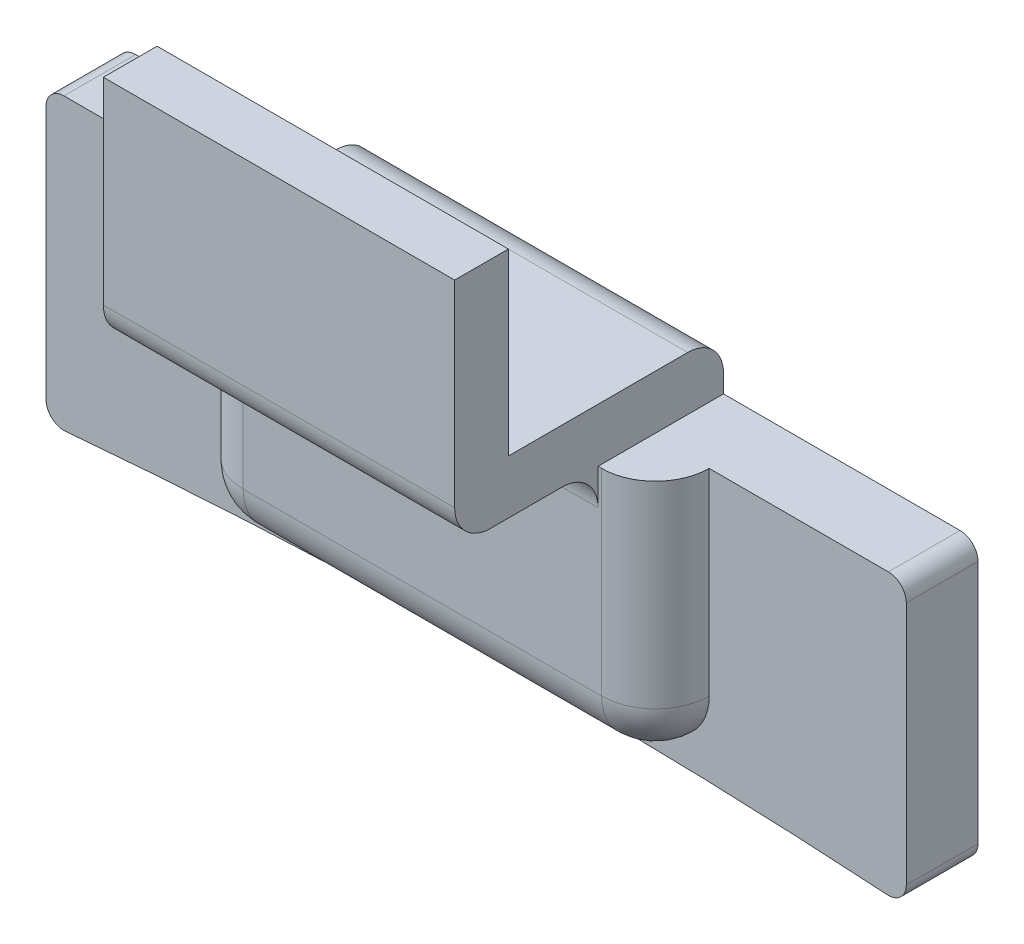
ISO-10303-21;
HEADER;
FILE_DESCRIPTION(('STEP AP214'),'2;1');
FILE_NAME('part.step','',(''),(''),'','','');
FILE_SCHEMA(('AUTOMOTIVE_DESIGN { 1 0 10303 214 1 1 1 1 }'));
ENDSEC;
DATA;
#1=APPLICATION_CONTEXT('core data for automotive mechanical design processes');
#2=APPLICATION_PROTOCOL_DEFINITION('international standard','automotive_design',2000,#1);
#3=PRODUCT_CONTEXT('',#1,'mechanical');
#4=PRODUCT('Part','Part','',(#3));
#5=PRODUCT_RELATED_PRODUCT_CATEGORY('part','',(#4));
#6=PRODUCT_DEFINITION_FORMATION('','',#4);
#7=PRODUCT_DEFINITION_CONTEXT('part definition',#1,'design');
#8=PRODUCT_DEFINITION('design','',#6,#7);
#9=PRODUCT_DEFINITION_SHAPE('','',#8);
#10=(LENGTH_UNIT() NAMED_UNIT(*) SI_UNIT(.MILLI.,.METRE.));
#11=(NAMED_UNIT(*) PLANE_ANGLE_UNIT() SI_UNIT($,.RADIAN.));
#12=(NAMED_UNIT(*) SI_UNIT($,.STERADIAN.) SOLID_ANGLE_UNIT());
#13=UNCERTAINTY_MEASURE_WITH_UNIT(LENGTH_MEASURE(1.E-05),#10,'distance_accuracy_value','');
#14=(GEOMETRIC_REPRESENTATION_CONTEXT(3) GLOBAL_UNCERTAINTY_ASSIGNED_CONTEXT((#13)) GLOBAL_UNIT_ASSIGNED_CONTEXT((#10,
#11,#12)) REPRESENTATION_CONTEXT('',''));
#15=CARTESIAN_POINT('',(0.,0.,0.));
#16=DIRECTION('',(0.,0.,1.));
#17=DIRECTION('',(1.,0.,0.));
#18=AXIS2_PLACEMENT_3D('',#15,#16,#17);
#19=CARTESIAN_POINT('',(0.,0.,7.));
#20=DIRECTION('',(0.,0.,-1.));
#21=DIRECTION('',(-1.,0.,0.));
#22=AXIS2_PLACEMENT_3D('',#19,#20,#21);
#23=PLANE('',#22);
#24=DIRECTION('',(-1.,0.,0.));
#25=VECTOR('',#24,1.);
#26=CARTESIAN_POINT('',(-16.5000000737673,0.,7.));
#27=LINE('',#26,#25);
#28=CARTESIAN_POINT('',(6.49999992623271,0.,7.));
#29=VERTEX_POINT('',#28);
#30=CARTESIAN_POINT('',(6.29999992623272,0.,7.));
#31=VERTEX_POINT('',#30);
#32=EDGE_CURVE('E252',#29,#31,#27,.T.);
#33=ORIENTED_EDGE('',*,*,#32,.T.);
#34=DIRECTION('',(0.,-1.,0.));
#35=VECTOR('',#34,1.);
#36=CARTESIAN_POINT('',(6.29999992623272,3.,7.));
#37=LINE('',#36,#35);
#38=CARTESIAN_POINT('',(6.29999992623272,-2.,7.));
#39=VERTEX_POINT('',#38);
#40=EDGE_CURVE('E48',#31,#39,#37,.T.);
#41=ORIENTED_EDGE('',*,*,#40,.T.);
#42=DIRECTION('',(1.,0.,0.));
#43=VECTOR('',#42,1.);
#44=CARTESIAN_POINT('',(-13.3000000737673,-2.,7.));
#45=LINE('',#44,#43);
#46=CARTESIAN_POINT('',(-13.3000000737673,-2.,7.));
#47=VERTEX_POINT('',#46);
#48=EDGE_CURVE('E283',#39,#47,#45,.F.);
#49=ORIENTED_EDGE('',*,*,#48,.T.);
#50=DIRECTION('',(0.,1.,0.));
#51=VECTOR('',#50,1.);
#52=CARTESIAN_POINT('',(-13.3000000737673,3.,7.));
#53=LINE('',#52,#51);
#54=CARTESIAN_POINT('',(-13.3000000737673,0.,7.));
#55=VERTEX_POINT('',#54);
#56=EDGE_CURVE('E281',#47,#55,#53,.T.);
#57=ORIENTED_EDGE('',*,*,#56,.T.);
#58=CARTESIAN_POINT('',(-13.5000000737673,0.,7.));
#59=VERTEX_POINT('',#58);
#60=EDGE_CURVE('E255',#55,#59,#27,.T.);
#61=ORIENTED_EDGE('',*,*,#60,.T.);
#62=DIRECTION('',(0.,-1.,0.));
#63=VECTOR('',#62,1.);
#64=CARTESIAN_POINT('',(-13.5000000737673,0.,7.));
#65=LINE('',#64,#63);
#66=CARTESIAN_POINT('',(-13.5000000737673,-11.,7.));
#67=VERTEX_POINT('',#66);
#68=EDGE_CURVE('E611',#59,#67,#65,.T.);
#69=ORIENTED_EDGE('',*,*,#68,.T.);
#70=DIRECTION('',(1.,0.,0.));
#71=VECTOR('',#70,1.);
#72=CARTESIAN_POINT('',(0.,-11.,7.));
#73=LINE('',#72,#71);
#74=CARTESIAN_POINT('',(6.49999992623272,-11.,7.));
#75=VERTEX_POINT('',#74);
#76=EDGE_CURVE('E613',#67,#75,#73,.T.);
#77=ORIENTED_EDGE('',*,*,#76,.T.);
#78=DIRECTION('',(0.,1.,0.));
#79=VECTOR('',#78,1.);
#80=CARTESIAN_POINT('',(6.49999992623272,0.,7.));
#81=LINE('',#80,#79);
#82=EDGE_CURVE('E624',#75,#29,#81,.T.);
#83=ORIENTED_EDGE('',*,*,#82,.T.);
#84=EDGE_LOOP('',(#33,#41,#49,#57,#61,#69,#77,#83));
#85=FACE_BOUND('',#84,.T.);
#86=ADVANCED_FACE('F33',(#85),#23,.F.);
#87=CARTESIAN_POINT('',(-27.5000000737673,0.,4.));
#88=DIRECTION('',(0.,1.,0.));
#89=DIRECTION('',(-1.,0.,0.));
#90=AXIS2_PLACEMENT_3D('',#87,#88,#89);
#91=PLANE('',#90);
#92=DIRECTION('',(1.,0.,0.));
#93=VECTOR('',#92,1.);
#94=CARTESIAN_POINT('',(-27.5000000737673,0.,0.));
#95=LINE('',#94,#93);
#96=CARTESIAN_POINT('',(6.29999992623272,0.,0.));
#97=VERTEX_POINT('',#96);
#98=CARTESIAN_POINT('',(19.4999999262327,0.,0.));
#99=VERTEX_POINT('',#98);
#100=EDGE_CURVE('E707',#97,#99,#95,.T.);
#101=ORIENTED_EDGE('',*,*,#100,.F.);
#102=DIRECTION('',(0.,0.,-1.));
#103=VECTOR('',#102,1.);
#104=CARTESIAN_POINT('',(6.29999992623272,0.,6.99999999999999));
#105=LINE('',#104,#103);
#106=EDGE_CURVE('E238',#31,#97,#105,.T.);
#107=ORIENTED_EDGE('',*,*,#106,.F.);
#108=ORIENTED_EDGE('',*,*,#32,.F.);
#109=CARTESIAN_POINT('',(6.49999992623272,0.,4.));
#110=DIRECTION('',(0.,1.,0.));
#111=DIRECTION('',(-1.,0.,0.));
#112=AXIS2_PLACEMENT_3D('',#109,#110,#111);
#113=CIRCLE('',#112,3.);
#114=CARTESIAN_POINT('',(9.49999992623272,0.,4.));
#115=VERTEX_POINT('',#114);
#116=EDGE_CURVE('E614',#29,#115,#113,.T.);
#117=ORIENTED_EDGE('',*,*,#116,.T.);
#118=DIRECTION('',(1.,0.,0.));
#119=VECTOR('',#118,1.);
#120=CARTESIAN_POINT('',(-27.5000000737673,0.,4.));
#121=LINE('',#120,#119);
#122=CARTESIAN_POINT('',(19.4999999262327,0.,4.));
#123=VERTEX_POINT('',#122);
#124=EDGE_CURVE('E660',#115,#123,#121,.T.);
#125=ORIENTED_EDGE('',*,*,#124,.T.);
#126=DIRECTION('',(0.,0.,-1.));
#127=VECTOR('',#126,1.);
#128=CARTESIAN_POINT('',(19.4999999262327,0.,4.));
#129=LINE('',#128,#127);
#130=EDGE_CURVE('E637',#123,#99,#129,.T.);
#131=ORIENTED_EDGE('',*,*,#130,.T.);
#132=EDGE_LOOP('',(#101,#107,#108,#117,#125,#131));
#133=FACE_BOUND('',#132,.T.);
#134=ADVANCED_FACE('F336',(#133),#91,.T.);
#135=ORIENTED_EDGE('',*,*,#60,.F.);
#136=DIRECTION('',(0.,0.,1.));
#137=VECTOR('',#136,1.);
#138=CARTESIAN_POINT('',(-13.3000000737673,0.,7.));
#139=LINE('',#138,#137);
#140=CARTESIAN_POINT('',(-13.3000000737673,0.,0.));
#141=VERTEX_POINT('',#140);
#142=EDGE_CURVE('E242',#141,#55,#139,.T.);
#143=ORIENTED_EDGE('',*,*,#142,.F.);
#144=CARTESIAN_POINT('',(-26.5000000737673,0.,0.));
#145=VERTEX_POINT('',#144);
#146=EDGE_CURVE('E330',#145,#141,#95,.T.);
#147=ORIENTED_EDGE('',*,*,#146,.F.);
#148=DIRECTION('',(0.,0.,-1.));
#149=VECTOR('',#148,1.);
#150=CARTESIAN_POINT('',(-26.5000000737673,0.,4.));
#151=LINE('',#150,#149);
#152=CARTESIAN_POINT('',(-26.5000000737673,0.,4.));
#153=VERTEX_POINT('',#152);
#154=EDGE_CURVE('E640',#145,#153,#151,.F.);
#155=ORIENTED_EDGE('',*,*,#154,.T.);
#156=CARTESIAN_POINT('',(-16.5000000737673,0.,4.));
#157=VERTEX_POINT('',#156);
#158=EDGE_CURVE('E656',#153,#157,#121,.T.);
#159=ORIENTED_EDGE('',*,*,#158,.T.);
#160=CARTESIAN_POINT('',(-13.5000000737673,0.,4.));
#161=DIRECTION('',(0.,1.,0.));
#162=DIRECTION('',(-1.,0.,0.));
#163=AXIS2_PLACEMENT_3D('',#160,#161,#162);
#164=CIRCLE('',#163,3.);
#165=EDGE_CURVE('E607',#157,#59,#164,.T.);
#166=ORIENTED_EDGE('',*,*,#165,.T.);
#167=EDGE_LOOP('',(#135,#143,#147,#155,#159,#166));
#168=FACE_BOUND('',#167,.T.);
#169=ADVANCED_FACE('F341',(#168),#91,.T.);
#170=CARTESIAN_POINT('',(-1.09287578986539E-12,-315.000000000012,4.));
#171=DIRECTION('',(0.,0.,-1.));
#172=DIRECTION('',(-1.,0.,0.));
#173=AXIS2_PLACEMENT_3D('',#170,#171,#172);
#174=CYLINDRICAL_SURFACE('',#173,299.999999999988);
#175=CARTESIAN_POINT('',(-1.09287578986539E-12,-315.000000000012,0.));
#176=DIRECTION('',(0.,0.,1.));
#177=DIRECTION('',(1.,0.,0.));
#178=AXIS2_PLACEMENT_3D('',#175,#176,#177);
#179=CIRCLE('',#178,299.999999999988);
#180=CARTESIAN_POINT('',(19.4352158733216,-15.6302079635571,0.));
#181=VERTEX_POINT('',#180);
#182=CARTESIAN_POINT('',(-26.4119602064126,-16.1649144460432,0.));
#183=VERTEX_POINT('',#182);
#184=EDGE_CURVE('E254',#181,#183,#179,.T.);
#185=ORIENTED_EDGE('',*,*,#184,.F.);
#186=DIRECTION('',(0.,0.,-1.));
#187=VECTOR('',#186,1.);
#188=CARTESIAN_POINT('',(19.4352158733216,-15.6302079635571,4.));
#189=LINE('',#188,#187);
#190=CARTESIAN_POINT('',(19.4352158733216,-15.6302079635571,4.));
#191=VERTEX_POINT('',#190);
#192=EDGE_CURVE('E655',#181,#191,#189,.F.);
#193=ORIENTED_EDGE('',*,*,#192,.T.);
#194=CARTESIAN_POINT('',(-1.09287578986539E-12,-315.000000000012,4.));
#195=DIRECTION('',(0.,0.,1.));
#196=DIRECTION('',(1.,0.,0.));
#197=AXIS2_PLACEMENT_3D('',#194,#195,#196);
#198=CIRCLE('',#197,299.999999999988);
#199=CARTESIAN_POINT('',(-26.4119602064126,-16.1649144460432,4.));
#200=VERTEX_POINT('',#199);
#201=EDGE_CURVE('E262',#191,#200,#198,.T.);
#202=ORIENTED_EDGE('',*,*,#201,.T.);
#203=DIRECTION('',(0.,0.,-1.));
#204=VECTOR('',#203,1.);
#205=CARTESIAN_POINT('',(-26.4119602064126,-16.1649144460431,4.));
#206=LINE('',#205,#204);
#207=EDGE_CURVE('E689',#200,#183,#206,.T.);
#208=ORIENTED_EDGE('',*,*,#207,.T.);
#209=EDGE_LOOP('',(#185,#193,#202,#208));
#210=FACE_BOUND('',#209,.T.);
#211=ADVANCED_FACE('F357',(#210),#174,.F.);
#212=CARTESIAN_POINT('',(20.4999999262327,0.,4.));
#213=DIRECTION('',(1.,0.,0.));
#214=DIRECTION('',(0.,1.,0.));
#215=AXIS2_PLACEMENT_3D('',#212,#213,#214);
#216=PLANE('',#215);
#217=DIRECTION('',(0.,-1.,0.));
#218=VECTOR('',#217,1.);
#219=CARTESIAN_POINT('',(20.4999999262327,0.,4.));
#220=LINE('',#219,#218);
#221=CARTESIAN_POINT('',(20.4999999262327,-1.,4.));
#222=VERTEX_POINT('',#221);
#223=CARTESIAN_POINT('',(20.4999999262327,-14.6323086567688,4.));
#224=VERTEX_POINT('',#223);
#225=EDGE_CURVE('E659',#222,#224,#220,.T.);
#226=ORIENTED_EDGE('',*,*,#225,.T.);
#227=DIRECTION('',(0.,0.,-1.));
#228=VECTOR('',#227,1.);
#229=CARTESIAN_POINT('',(20.4999999262327,-14.6323086567688,4.));
#230=LINE('',#229,#228);
#231=CARTESIAN_POINT('',(20.4999999262327,-14.6323086567688,0.));
#232=VERTEX_POINT('',#231);
#233=EDGE_CURVE('E679',#224,#232,#230,.T.);
#234=ORIENTED_EDGE('',*,*,#233,.T.);
#235=DIRECTION('',(0.,-1.,0.));
#236=VECTOR('',#235,1.);
#237=CARTESIAN_POINT('',(20.4999999262327,0.,0.));
#238=LINE('',#237,#236);
#239=CARTESIAN_POINT('',(20.4999999262327,-1.,0.));
#240=VERTEX_POINT('',#239);
#241=EDGE_CURVE('E671',#240,#232,#238,.T.);
#242=ORIENTED_EDGE('',*,*,#241,.F.);
#243=DIRECTION('',(0.,0.,-1.));
#244=VECTOR('',#243,1.);
#245=CARTESIAN_POINT('',(20.4999999262327,-1.,4.));
#246=LINE('',#245,#244);
#247=EDGE_CURVE('E677',#240,#222,#246,.F.);
#248=ORIENTED_EDGE('',*,*,#247,.T.);
#249=EDGE_LOOP('',(#226,#234,#242,#248));
#250=FACE_BOUND('',#249,.T.);
#251=ADVANCED_FACE('F355',(#250),#216,.T.);
#252=CARTESIAN_POINT('',(-27.5000000737673,-16.2630756067663,4.));
#253=DIRECTION('',(-1.,0.,0.));
#254=DIRECTION('',(0.,0.,1.));
#255=AXIS2_PLACEMENT_3D('',#252,#253,#254);
#256=PLANE('',#255);
#257=DIRECTION('',(0.,1.,0.));
#258=VECTOR('',#257,1.);
#259=CARTESIAN_POINT('',(-27.5000000737673,-16.2630756067663,0.));
#260=LINE('',#259,#258);
#261=CARTESIAN_POINT('',(-27.5000000737673,-15.1687974941966,0.));
#262=VERTEX_POINT('',#261);
#263=CARTESIAN_POINT('',(-27.5000000737673,-0.999999999999994,0.));
#264=VERTEX_POINT('',#263);
#265=EDGE_CURVE('E708',#262,#264,#260,.T.);
#266=ORIENTED_EDGE('',*,*,#265,.F.);
#267=DIRECTION('',(0.,0.,-1.));
#268=VECTOR('',#267,1.);
#269=CARTESIAN_POINT('',(-27.5000000737673,-15.1687974941966,4.));
#270=LINE('',#269,#268);
#271=CARTESIAN_POINT('',(-27.5000000737673,-15.1687974941966,4.));
#272=VERTEX_POINT('',#271);
#273=EDGE_CURVE('E642',#262,#272,#270,.F.);
#274=ORIENTED_EDGE('',*,*,#273,.T.);
#275=DIRECTION('',(0.,1.,0.));
#276=VECTOR('',#275,1.);
#277=CARTESIAN_POINT('',(-27.5000000737673,-16.2630756067663,4.));
#278=LINE('',#277,#276);
#279=CARTESIAN_POINT('',(-27.5000000737673,-0.999999999999994,4.));
#280=VERTEX_POINT('',#279);
#281=EDGE_CURVE('E664',#272,#280,#278,.T.);
#282=ORIENTED_EDGE('',*,*,#281,.T.);
#283=DIRECTION('',(0.,0.,-1.));
#284=VECTOR('',#283,1.);
#285=CARTESIAN_POINT('',(-27.5000000737673,-0.999999999999994,4.));
#286=LINE('',#285,#284);
#287=EDGE_CURVE('E644',#280,#264,#286,.T.);
#288=ORIENTED_EDGE('',*,*,#287,.T.);
#289=EDGE_LOOP('',(#266,#274,#282,#288));
#290=FACE_BOUND('',#289,.T.);
#291=ADVANCED_FACE('F350',(#290),#256,.T.);
#292=CARTESIAN_POINT('',(-1.09287578986539E-12,-315.000000000012,4.));
#293=DIRECTION('',(0.,0.,1.));
#294=DIRECTION('',(1.,0.,0.));
#295=AXIS2_PLACEMENT_3D('',#292,#293,#294);
#296=PLANE('',#295);
#297=ORIENTED_EDGE('',*,*,#201,.F.);
#298=CARTESIAN_POINT('',(19.4999999262327,-14.6323086567688,4.));
#299=DIRECTION('',(0.,0.,1.));
#300=DIRECTION('',(1.,0.,0.));
#301=AXIS2_PLACEMENT_3D('',#298,#299,#300);
#302=CIRCLE('',#301,1.);
#303=EDGE_CURVE('E647',#191,#224,#302,.T.);
#304=ORIENTED_EDGE('',*,*,#303,.T.);
#305=ORIENTED_EDGE('',*,*,#225,.F.);
#306=CARTESIAN_POINT('',(19.4999999262327,-1.,4.));
#307=DIRECTION('',(0.,0.,1.));
#308=DIRECTION('',(1.,0.,0.));
#309=AXIS2_PLACEMENT_3D('',#306,#307,#308);
#310=CIRCLE('',#309,1.);
#311=EDGE_CURVE('E651',#222,#123,#310,.T.);
#312=ORIENTED_EDGE('',*,*,#311,.T.);
#313=ORIENTED_EDGE('',*,*,#124,.F.);
#314=DIRECTION('',(0.,1.,0.));
#315=VECTOR('',#314,1.);
#316=CARTESIAN_POINT('',(9.49999992623272,0.,4.));
#317=LINE('',#316,#315);
#318=CARTESIAN_POINT('',(9.49999992623272,-11.,4.));
#319=VERTEX_POINT('',#318);
#320=EDGE_CURVE('E259',#319,#115,#317,.T.);
#321=ORIENTED_EDGE('',*,*,#320,.F.);
#322=CARTESIAN_POINT('',(6.49999992623272,-11.,4.));
#323=DIRECTION('',(0.,0.,1.));
#324=DIRECTION('',(1.,0.,0.));
#325=AXIS2_PLACEMENT_3D('',#322,#323,#324);
#326=CIRCLE('',#325,3.);
#327=CARTESIAN_POINT('',(6.49999992623272,-14.,4.));
#328=VERTEX_POINT('',#327);
#329=EDGE_CURVE('E273',#319,#328,#326,.F.);
#330=ORIENTED_EDGE('',*,*,#329,.T.);
#331=DIRECTION('',(1.,0.,0.));
#332=VECTOR('',#331,1.);
#333=CARTESIAN_POINT('',(9.49999992623272,-14.,4.));
#334=LINE('',#333,#332);
#335=CARTESIAN_POINT('',(-13.5000000737673,-14.,4.));
#336=VERTEX_POINT('',#335);
#337=EDGE_CURVE('E256',#336,#328,#334,.T.);
#338=ORIENTED_EDGE('',*,*,#337,.F.);
#339=CARTESIAN_POINT('',(-13.5000000737673,-11.,4.));
#340=DIRECTION('',(0.,0.,1.));
#341=DIRECTION('',(1.,0.,0.));
#342=AXIS2_PLACEMENT_3D('',#339,#340,#341);
#343=CIRCLE('',#342,3.);
#344=CARTESIAN_POINT('',(-16.5000000737673,-11.,4.));
#345=VERTEX_POINT('',#344);
#346=EDGE_CURVE('E271',#336,#345,#343,.F.);
#347=ORIENTED_EDGE('',*,*,#346,.T.);
#348=DIRECTION('',(0.,-1.,0.));
#349=VECTOR('',#348,1.);
#350=CARTESIAN_POINT('',(-16.5000000737673,-14.,4.));
#351=LINE('',#350,#349);
#352=EDGE_CURVE('E251',#157,#345,#351,.T.);
#353=ORIENTED_EDGE('',*,*,#352,.F.);
#354=ORIENTED_EDGE('',*,*,#158,.F.);
#355=CARTESIAN_POINT('',(-26.5000000737673,-0.999999999999994,4.));
#356=DIRECTION('',(0.,0.,1.));
#357=DIRECTION('',(1.,0.,0.));
#358=AXIS2_PLACEMENT_3D('',#355,#356,#357);
#359=CIRCLE('',#358,1.);
#360=EDGE_CURVE('E653',#153,#280,#359,.T.);
#361=ORIENTED_EDGE('',*,*,#360,.T.);
#362=ORIENTED_EDGE('',*,*,#281,.F.);
#363=CARTESIAN_POINT('',(-26.5000000737673,-15.1687974941966,4.));
#364=DIRECTION('',(0.,0.,1.));
#365=DIRECTION('',(1.,0.,0.));
#366=AXIS2_PLACEMENT_3D('',#363,#364,#365);
#367=CIRCLE('',#366,1.);
#368=EDGE_CURVE('E649',#272,#200,#367,.T.);
#369=ORIENTED_EDGE('',*,*,#368,.T.);
#370=EDGE_LOOP('',(#297,#304,#305,#312,#313,#321,#330,#338,#347,#353,#354,#361,#362,#369));
#371=FACE_BOUND('',#370,.T.);
#372=ADVANCED_FACE('F347',(#371),#296,.T.);
#373=CARTESIAN_POINT('',(-1.09287578986539E-12,-315.000000000012,0.));
#374=DIRECTION('',(0.,0.,1.));
#375=DIRECTION('',(1.,0.,0.));
#376=AXIS2_PLACEMENT_3D('',#373,#374,#375);
#377=PLANE('',#376);
#378=DIRECTION('',(0.,-1.,0.));
#379=VECTOR('',#378,1.);
#380=CARTESIAN_POINT('',(-13.3000000737673,3.,0.));
#381=LINE('',#380,#379);
#382=CARTESIAN_POINT('',(-13.3000000737673,1.,0.));
#383=VERTEX_POINT('',#382);
#384=EDGE_CURVE('E244',#383,#141,#381,.T.);
#385=ORIENTED_EDGE('',*,*,#384,.F.);
#386=DIRECTION('',(-1.,0.,0.));
#387=VECTOR('',#386,1.);
#388=CARTESIAN_POINT('',(6.29999992623272,0.999999999999999,0.));
#389=LINE('',#388,#387);
#390=CARTESIAN_POINT('',(6.29999992623272,0.999999999999999,0.));
#391=VERTEX_POINT('',#390);
#392=EDGE_CURVE('E299',#383,#391,#389,.F.);
#393=ORIENTED_EDGE('',*,*,#392,.T.);
#394=DIRECTION('',(0.,-1.,0.));
#395=VECTOR('',#394,1.);
#396=CARTESIAN_POINT('',(6.29999992623272,3.,0.));
#397=LINE('',#396,#395);
#398=EDGE_CURVE('E249',#391,#97,#397,.T.);
#399=ORIENTED_EDGE('',*,*,#398,.T.);
#400=ORIENTED_EDGE('',*,*,#100,.T.);
#401=CARTESIAN_POINT('',(19.4999999262327,-1.,0.));
#402=DIRECTION('',(0.,0.,1.));
#403=DIRECTION('',(1.,0.,0.));
#404=AXIS2_PLACEMENT_3D('',#401,#402,#403);
#405=CIRCLE('',#404,1.);
#406=EDGE_CURVE('E684',#99,#240,#405,.F.);
#407=ORIENTED_EDGE('',*,*,#406,.T.);
#408=ORIENTED_EDGE('',*,*,#241,.T.);
#409=CARTESIAN_POINT('',(19.4999999262327,-14.6323086567688,0.));
#410=DIRECTION('',(0.,0.,1.));
#411=DIRECTION('',(1.,0.,0.));
#412=AXIS2_PLACEMENT_3D('',#409,#410,#411);
#413=CIRCLE('',#412,1.);
#414=EDGE_CURVE('E688',#232,#181,#413,.F.);
#415=ORIENTED_EDGE('',*,*,#414,.T.);
#416=ORIENTED_EDGE('',*,*,#184,.T.);
#417=CARTESIAN_POINT('',(-26.5000000737673,-15.1687974941966,0.));
#418=DIRECTION('',(0.,0.,1.));
#419=DIRECTION('',(1.,0.,0.));
#420=AXIS2_PLACEMENT_3D('',#417,#418,#419);
#421=CIRCLE('',#420,1.);
#422=EDGE_CURVE('E686',#183,#262,#421,.F.);
#423=ORIENTED_EDGE('',*,*,#422,.T.);
#424=ORIENTED_EDGE('',*,*,#265,.T.);
#425=CARTESIAN_POINT('',(-26.5000000737673,-0.999999999999994,0.));
#426=DIRECTION('',(0.,0.,1.));
#427=DIRECTION('',(1.,0.,0.));
#428=AXIS2_PLACEMENT_3D('',#425,#426,#427);
#429=CIRCLE('',#428,1.);
#430=EDGE_CURVE('E682',#264,#145,#429,.F.);
#431=ORIENTED_EDGE('',*,*,#430,.T.);
#432=ORIENTED_EDGE('',*,*,#146,.T.);
#433=EDGE_LOOP('',(#385,#393,#399,#400,#407,#408,#415,#416,#423,#424,#431,#432));
#434=FACE_BOUND('',#433,.T.);
#435=ADVANCED_FACE('F328',(#434),#377,.F.);
#436=CARTESIAN_POINT('',(19.4999999262327,-14.6323086567688,4.));
#437=DIRECTION('',(0.,0.,-1.));
#438=DIRECTION('',(-1.,0.,0.));
#439=AXIS2_PLACEMENT_3D('',#436,#437,#438);
#440=CYLINDRICAL_SURFACE('',#439,1.);
#441=ORIENTED_EDGE('',*,*,#303,.F.);
#442=ORIENTED_EDGE('',*,*,#192,.F.);
#443=ORIENTED_EDGE('',*,*,#414,.F.);
#444=ORIENTED_EDGE('',*,*,#233,.F.);
#445=EDGE_LOOP('',(#441,#442,#443,#444));
#446=FACE_BOUND('',#445,.T.);
#447=ADVANCED_FACE('F354',(#446),#440,.T.);
#448=CARTESIAN_POINT('',(-26.5000000737673,-15.1687974941966,4.));
#449=DIRECTION('',(0.,0.,-1.));
#450=DIRECTION('',(-1.,0.,0.));
#451=AXIS2_PLACEMENT_3D('',#448,#449,#450);
#452=CYLINDRICAL_SURFACE('',#451,1.);
#453=ORIENTED_EDGE('',*,*,#368,.F.);
#454=ORIENTED_EDGE('',*,*,#273,.F.);
#455=ORIENTED_EDGE('',*,*,#422,.F.);
#456=ORIENTED_EDGE('',*,*,#207,.F.);
#457=EDGE_LOOP('',(#453,#454,#455,#456));
#458=FACE_BOUND('',#457,.T.);
#459=ADVANCED_FACE('F368',(#458),#452,.T.);
#460=CARTESIAN_POINT('',(19.4999999262327,-1.,4.));
#461=DIRECTION('',(0.,0.,-1.));
#462=DIRECTION('',(-1.,0.,0.));
#463=AXIS2_PLACEMENT_3D('',#460,#461,#462);
#464=CYLINDRICAL_SURFACE('',#463,1.);
#465=ORIENTED_EDGE('',*,*,#311,.F.);
#466=ORIENTED_EDGE('',*,*,#247,.F.);
#467=ORIENTED_EDGE('',*,*,#406,.F.);
#468=ORIENTED_EDGE('',*,*,#130,.F.);
#469=EDGE_LOOP('',(#465,#466,#467,#468));
#470=FACE_BOUND('',#469,.T.);
#471=ADVANCED_FACE('F372',(#470),#464,.T.);
#472=CARTESIAN_POINT('',(-26.5000000737673,-0.999999999999994,4.));
#473=DIRECTION('',(0.,0.,-1.));
#474=DIRECTION('',(-1.,0.,0.));
#475=AXIS2_PLACEMENT_3D('',#472,#473,#474);
#476=CYLINDRICAL_SURFACE('',#475,1.);
#477=ORIENTED_EDGE('',*,*,#360,.F.);
#478=ORIENTED_EDGE('',*,*,#154,.F.);
#479=ORIENTED_EDGE('',*,*,#430,.F.);
#480=ORIENTED_EDGE('',*,*,#287,.F.);
#481=EDGE_LOOP('',(#477,#478,#479,#480));
#482=FACE_BOUND('',#481,.T.);
#483=ADVANCED_FACE('F376',(#482),#476,.T.);
#484=CARTESIAN_POINT('',(-13.5000000737673,0.,4.));
#485=DIRECTION('',(0.,-1.,0.));
#486=DIRECTION('',(0.,0.,-1.));
#487=AXIS2_PLACEMENT_3D('',#484,#485,#486);
#488=CYLINDRICAL_SURFACE('',#487,3.);
#489=ORIENTED_EDGE('',*,*,#352,.T.);
#490=CARTESIAN_POINT('',(-13.5000000737673,-11.,4.));
#491=DIRECTION('',(0.,-1.,0.));
#492=DIRECTION('',(0.,0.,-1.));
#493=AXIS2_PLACEMENT_3D('',#490,#491,#492);
#494=CIRCLE('',#493,3.);
#495=EDGE_CURVE('E267',#345,#67,#494,.F.);
#496=ORIENTED_EDGE('',*,*,#495,.T.);
#497=ORIENTED_EDGE('',*,*,#68,.F.);
#498=ORIENTED_EDGE('',*,*,#165,.F.);
#499=EDGE_LOOP('',(#489,#496,#497,#498));
#500=FACE_BOUND('',#499,.T.);
#501=ADVANCED_FACE('F380',(#500),#488,.T.);
#502=CARTESIAN_POINT('',(6.49999992623272,0.,4.));
#503=DIRECTION('',(0.,1.,0.));
#504=DIRECTION('',(-1.,0.,0.));
#505=AXIS2_PLACEMENT_3D('',#502,#503,#504);
#506=CYLINDRICAL_SURFACE('',#505,3.);
#507=ORIENTED_EDGE('',*,*,#82,.F.);
#508=CARTESIAN_POINT('',(6.49999992623272,-11.,4.));
#509=DIRECTION('',(0.,1.,0.));
#510=DIRECTION('',(-1.,0.,0.));
#511=AXIS2_PLACEMENT_3D('',#508,#509,#510);
#512=CIRCLE('',#511,3.);
#513=EDGE_CURVE('E269',#75,#319,#512,.T.);
#514=ORIENTED_EDGE('',*,*,#513,.T.);
#515=ORIENTED_EDGE('',*,*,#320,.T.);
#516=ORIENTED_EDGE('',*,*,#116,.F.);
#517=EDGE_LOOP('',(#507,#514,#515,#516));
#518=FACE_BOUND('',#517,.T.);
#519=ADVANCED_FACE('F386',(#518),#506,.T.);
#520=CARTESIAN_POINT('',(0.,-11.,4.));
#521=DIRECTION('',(1.,0.,0.));
#522=DIRECTION('',(0.,1.,0.));
#523=AXIS2_PLACEMENT_3D('',#520,#521,#522);
#524=CYLINDRICAL_SURFACE('',#523,3.);
#525=ORIENTED_EDGE('',*,*,#76,.F.);
#526=CARTESIAN_POINT('',(-13.5000000737673,-11.,4.));
#527=DIRECTION('',(1.,0.,0.));
#528=DIRECTION('',(0.,1.,0.));
#529=AXIS2_PLACEMENT_3D('',#526,#527,#528);
#530=CIRCLE('',#529,3.);
#531=EDGE_CURVE('E619',#67,#336,#530,.T.);
#532=ORIENTED_EDGE('',*,*,#531,.T.);
#533=ORIENTED_EDGE('',*,*,#337,.T.);
#534=CARTESIAN_POINT('',(6.49999992623272,-11.,4.));
#535=DIRECTION('',(1.,0.,0.));
#536=DIRECTION('',(0.,1.,0.));
#537=AXIS2_PLACEMENT_3D('',#534,#535,#536);
#538=CIRCLE('',#537,3.);
#539=EDGE_CURVE('E622',#328,#75,#538,.F.);
#540=ORIENTED_EDGE('',*,*,#539,.T.);
#541=EDGE_LOOP('',(#525,#532,#533,#540));
#542=FACE_BOUND('',#541,.T.);
#543=ADVANCED_FACE('F382',(#542),#524,.T.);
#544=CARTESIAN_POINT('',(-13.5000000737673,-11.,4.));
#545=DIRECTION('',(0.,0.,1.));
#546=DIRECTION('',(1.,0.,0.));
#547=AXIS2_PLACEMENT_3D('',#544,#545,#546);
#548=SPHERICAL_SURFACE('',#547,3.);
#549=ORIENTED_EDGE('',*,*,#531,.F.);
#550=ORIENTED_EDGE('',*,*,#495,.F.);
#551=ORIENTED_EDGE('',*,*,#346,.F.);
#552=EDGE_LOOP('',(#549,#550,#551));
#553=FACE_BOUND('',#552,.T.);
#554=ADVANCED_FACE('F385',(#553),#548,.T.);
#555=CARTESIAN_POINT('',(6.49999992623272,-11.,4.));
#556=DIRECTION('',(0.,0.,1.));
#557=DIRECTION('',(1.,0.,0.));
#558=AXIS2_PLACEMENT_3D('',#555,#556,#557);
#559=SPHERICAL_SURFACE('',#558,3.);
#560=ORIENTED_EDGE('',*,*,#329,.F.);
#561=ORIENTED_EDGE('',*,*,#513,.F.);
#562=ORIENTED_EDGE('',*,*,#539,.F.);
#563=EDGE_LOOP('',(#560,#561,#562));
#564=FACE_BOUND('',#563,.T.);
#565=ADVANCED_FACE('F396',(#564),#559,.T.);
#566=CARTESIAN_POINT('',(6.29999992623272,3.,6.99999999999999));
#567=DIRECTION('',(-1.,0.,0.));
#568=DIRECTION('',(0.,0.,1.));
#569=AXIS2_PLACEMENT_3D('',#566,#567,#568);
#570=PLANE('',#569);
#571=DIRECTION('',(0.,-1.,0.));
#572=VECTOR('',#571,1.);
#573=CARTESIAN_POINT('',(6.29999992623272,13.,15.));
#574=LINE('',#573,#572);
#575=CARTESIAN_POINT('',(6.29999992623272,13.,15.));
#576=VERTEX_POINT('',#575);
#577=CARTESIAN_POINT('',(6.29999992623272,2.,15.));
#578=VERTEX_POINT('',#577);
#579=EDGE_CURVE('E227',#576,#578,#574,.T.);
#580=ORIENTED_EDGE('',*,*,#579,.T.);
#581=CARTESIAN_POINT('',(6.29999992623271,2.,13.));
#582=DIRECTION('',(-1.,0.,0.));
#583=DIRECTION('',(0.,0.,1.));
#584=AXIS2_PLACEMENT_3D('',#581,#582,#583);
#585=CIRCLE('',#584,2.);
#586=CARTESIAN_POINT('',(6.29999992623272,0.,13.));
#587=VERTEX_POINT('',#586);
#588=EDGE_CURVE('E294',#578,#587,#585,.F.);
#589=ORIENTED_EDGE('',*,*,#588,.T.);
#590=DIRECTION('',(0.,0.,-1.));
#591=VECTOR('',#590,1.);
#592=CARTESIAN_POINT('',(6.29999992623272,0.,12.));
#593=LINE('',#592,#591);
#594=CARTESIAN_POINT('',(6.29999992623272,0.,9.));
#595=VERTEX_POINT('',#594);
#596=EDGE_CURVE('E232',#587,#595,#593,.T.);
#597=ORIENTED_EDGE('',*,*,#596,.T.);
#598=CARTESIAN_POINT('',(6.29999992623271,-2.,9.));
#599=DIRECTION('',(-1.,0.,0.));
#600=DIRECTION('',(0.,0.,1.));
#601=AXIS2_PLACEMENT_3D('',#598,#599,#600);
#602=CIRCLE('',#601,2.);
#603=EDGE_CURVE('E41',#595,#39,#602,.T.);
#604=ORIENTED_EDGE('',*,*,#603,.T.);
#605=ORIENTED_EDGE('',*,*,#40,.F.);
#606=ORIENTED_EDGE('',*,*,#106,.T.);
#607=ORIENTED_EDGE('',*,*,#398,.F.);
#608=CARTESIAN_POINT('',(6.29999992623272,0.999999999999999,2.));
#609=DIRECTION('',(-1.,0.,0.));
#610=DIRECTION('',(0.,0.,1.));
#611=AXIS2_PLACEMENT_3D('',#608,#609,#610);
#612=CIRCLE('',#611,2.);
#613=CARTESIAN_POINT('',(6.29999992623272,3.,2.));
#614=VERTEX_POINT('',#613);
#615=EDGE_CURVE('E55',#391,#614,#612,.F.);
#616=ORIENTED_EDGE('',*,*,#615,.T.);
#617=DIRECTION('',(0.,0.,-1.));
#618=VECTOR('',#617,1.);
#619=CARTESIAN_POINT('',(6.29999992623272,3.,6.99999999999999));
#620=LINE('',#619,#618);
#621=CARTESIAN_POINT('',(6.29999992623272,3.,12.));
#622=VERTEX_POINT('',#621);
#623=EDGE_CURVE('E239',#622,#614,#620,.T.);
#624=ORIENTED_EDGE('',*,*,#623,.F.);
#625=DIRECTION('',(0.,-1.,0.));
#626=VECTOR('',#625,1.);
#627=CARTESIAN_POINT('',(6.29999992623272,13.,12.));
#628=LINE('',#627,#626);
#629=CARTESIAN_POINT('',(6.29999992623272,13.,12.));
#630=VERTEX_POINT('',#629);
#631=EDGE_CURVE('E205',#630,#622,#628,.T.);
#632=ORIENTED_EDGE('',*,*,#631,.F.);
#633=DIRECTION('',(0.,0.,1.));
#634=VECTOR('',#633,1.);
#635=CARTESIAN_POINT('',(6.29999992623272,13.,12.));
#636=LINE('',#635,#634);
#637=EDGE_CURVE('E216',#630,#576,#636,.T.);
#638=ORIENTED_EDGE('',*,*,#637,.T.);
#639=EDGE_LOOP('',(#580,#589,#597,#604,#605,#606,#607,#616,#624,#632,#638));
#640=FACE_BOUND('',#639,.T.);
#641=ADVANCED_FACE('F300',(#640),#570,.F.);
#642=CARTESIAN_POINT('',(-13.3000000737673,3.,7.));
#643=DIRECTION('',(1.,0.,0.));
#644=DIRECTION('',(0.,1.,0.));
#645=AXIS2_PLACEMENT_3D('',#642,#643,#644);
#646=PLANE('',#645);
#647=DIRECTION('',(0.,0.,-1.));
#648=VECTOR('',#647,1.);
#649=CARTESIAN_POINT('',(-13.3000000737673,0.,12.));
#650=LINE('',#649,#648);
#651=CARTESIAN_POINT('',(-13.3000000737673,0.,13.));
#652=VERTEX_POINT('',#651);
#653=CARTESIAN_POINT('',(-13.3000000737673,0.,9.));
#654=VERTEX_POINT('',#653);
#655=EDGE_CURVE('E235',#652,#654,#650,.T.);
#656=ORIENTED_EDGE('',*,*,#655,.F.);
#657=CARTESIAN_POINT('',(-13.3000000737673,2.,13.));
#658=DIRECTION('',(1.,0.,0.));
#659=DIRECTION('',(0.,1.,0.));
#660=AXIS2_PLACEMENT_3D('',#657,#658,#659);
#661=CIRCLE('',#660,2.);
#662=CARTESIAN_POINT('',(-13.3000000737673,2.,15.));
#663=VERTEX_POINT('',#662);
#664=EDGE_CURVE('E289',#652,#663,#661,.F.);
#665=ORIENTED_EDGE('',*,*,#664,.T.);
#666=DIRECTION('',(0.,-1.,0.));
#667=VECTOR('',#666,1.);
#668=CARTESIAN_POINT('',(-13.3000000737673,13.,15.));
#669=LINE('',#668,#667);
#670=CARTESIAN_POINT('',(-13.3000000737673,13.,15.));
#671=VERTEX_POINT('',#670);
#672=EDGE_CURVE('E221',#671,#663,#669,.T.);
#673=ORIENTED_EDGE('',*,*,#672,.F.);
#674=DIRECTION('',(0.,0.,-1.));
#675=VECTOR('',#674,1.);
#676=CARTESIAN_POINT('',(-13.3000000737673,13.,12.));
#677=LINE('',#676,#675);
#678=CARTESIAN_POINT('',(-13.3000000737673,13.,12.));
#679=VERTEX_POINT('',#678);
#680=EDGE_CURVE('E213',#671,#679,#677,.T.);
#681=ORIENTED_EDGE('',*,*,#680,.T.);
#682=DIRECTION('',(0.,-1.,0.));
#683=VECTOR('',#682,1.);
#684=CARTESIAN_POINT('',(-13.3000000737673,13.,12.));
#685=LINE('',#684,#683);
#686=CARTESIAN_POINT('',(-13.3000000737673,3.,12.));
#687=VERTEX_POINT('',#686);
#688=EDGE_CURVE('E195',#679,#687,#685,.T.);
#689=ORIENTED_EDGE('',*,*,#688,.T.);
#690=DIRECTION('',(0.,0.,1.));
#691=VECTOR('',#690,1.);
#692=CARTESIAN_POINT('',(-13.3000000737673,3.,7.));
#693=LINE('',#692,#691);
#694=CARTESIAN_POINT('',(-13.3000000737673,3.,2.));
#695=VERTEX_POINT('',#694);
#696=EDGE_CURVE('E241',#695,#687,#693,.T.);
#697=ORIENTED_EDGE('',*,*,#696,.F.);
#698=CARTESIAN_POINT('',(-13.3000000737673,1.,2.));
#699=DIRECTION('',(1.,0.,0.));
#700=DIRECTION('',(0.,1.,0.));
#701=AXIS2_PLACEMENT_3D('',#698,#699,#700);
#702=CIRCLE('',#701,2.);
#703=EDGE_CURVE('E287',#695,#383,#702,.F.);
#704=ORIENTED_EDGE('',*,*,#703,.T.);
#705=ORIENTED_EDGE('',*,*,#384,.T.);
#706=ORIENTED_EDGE('',*,*,#142,.T.);
#707=ORIENTED_EDGE('',*,*,#56,.F.);
#708=CARTESIAN_POINT('',(-13.3000000737673,-2.,9.));
#709=DIRECTION('',(1.,0.,0.));
#710=DIRECTION('',(0.,1.,0.));
#711=AXIS2_PLACEMENT_3D('',#708,#709,#710);
#712=CIRCLE('',#711,2.);
#713=EDGE_CURVE('E11',#47,#654,#712,.T.);
#714=ORIENTED_EDGE('',*,*,#713,.T.);
#715=EDGE_LOOP('',(#656,#665,#673,#681,#689,#697,#704,#705,#706,#707,#714));
#716=FACE_BOUND('',#715,.T.);
#717=ADVANCED_FACE('F219',(#716),#646,.F.);
#718=CARTESIAN_POINT('',(0.,3.,0.));
#719=DIRECTION('',(0.,1.,0.));
#720=DIRECTION('',(-1.,0.,0.));
#721=AXIS2_PLACEMENT_3D('',#718,#719,#720);
#722=PLANE('',#721);
#723=ORIENTED_EDGE('',*,*,#623,.T.);
#724=DIRECTION('',(-1.,0.,0.));
#725=VECTOR('',#724,1.);
#726=CARTESIAN_POINT('',(-13.3000000737673,3.,2.));
#727=LINE('',#726,#725);
#728=EDGE_CURVE('E296',#614,#695,#727,.T.);
#729=ORIENTED_EDGE('',*,*,#728,.T.);
#730=ORIENTED_EDGE('',*,*,#696,.T.);
#731=DIRECTION('',(-1.,0.,0.));
#732=VECTOR('',#731,1.);
#733=CARTESIAN_POINT('',(6.29999992623272,3.,12.));
#734=LINE('',#733,#732);
#735=EDGE_CURVE('E201',#622,#687,#734,.T.);
#736=ORIENTED_EDGE('',*,*,#735,.F.);
#737=EDGE_LOOP('',(#723,#729,#730,#736));
#738=FACE_BOUND('',#737,.T.);
#739=ADVANCED_FACE('F321',(#738),#722,.T.);
#740=CARTESIAN_POINT('',(6.29999992623272,0.,12.));
#741=DIRECTION('',(0.,1.,0.));
#742=DIRECTION('',(0.,0.,1.));
#743=AXIS2_PLACEMENT_3D('',#740,#741,#742);
#744=PLANE('',#743);
#745=ORIENTED_EDGE('',*,*,#655,.T.);
#746=DIRECTION('',(1.,0.,0.));
#747=VECTOR('',#746,1.);
#748=CARTESIAN_POINT('',(6.29999992623272,0.,9.));
#749=LINE('',#748,#747);
#750=EDGE_CURVE('E278',#654,#595,#749,.T.);
#751=ORIENTED_EDGE('',*,*,#750,.T.);
#752=ORIENTED_EDGE('',*,*,#596,.F.);
#753=DIRECTION('',(-1.,0.,0.));
#754=VECTOR('',#753,1.);
#755=CARTESIAN_POINT('',(-13.3000000737673,0.,13.));
#756=LINE('',#755,#754);
#757=EDGE_CURVE('E275',#587,#652,#756,.T.);
#758=ORIENTED_EDGE('',*,*,#757,.T.);
#759=EDGE_LOOP('',(#745,#751,#752,#758));
#760=FACE_BOUND('',#759,.T.);
#761=ADVANCED_FACE('F311',(#760),#744,.F.);
#762=CARTESIAN_POINT('',(-13.3000000737673,13.,15.));
#763=DIRECTION('',(0.,0.,1.));
#764=DIRECTION('',(1.,0.,0.));
#765=AXIS2_PLACEMENT_3D('',#762,#763,#764);
#766=PLANE('',#765);
#767=ORIENTED_EDGE('',*,*,#672,.T.);
#768=DIRECTION('',(-1.,0.,0.));
#769=VECTOR('',#768,1.);
#770=CARTESIAN_POINT('',(6.29999992623272,2.,15.));
#771=LINE('',#770,#769);
#772=EDGE_CURVE('E291',#663,#578,#771,.F.);
#773=ORIENTED_EDGE('',*,*,#772,.T.);
#774=ORIENTED_EDGE('',*,*,#579,.F.);
#775=DIRECTION('',(-1.,0.,0.));
#776=VECTOR('',#775,1.);
#777=CARTESIAN_POINT('',(-13.3000000737673,13.,15.));
#778=LINE('',#777,#776);
#779=EDGE_CURVE('E206',#576,#671,#778,.T.);
#780=ORIENTED_EDGE('',*,*,#779,.T.);
#781=EDGE_LOOP('',(#767,#773,#774,#780));
#782=FACE_BOUND('',#781,.T.);
#783=ADVANCED_FACE('F318',(#782),#766,.T.);
#784=CARTESIAN_POINT('',(-13.3000000737673,13.,12.));
#785=DIRECTION('',(0.,0.,-1.));
#786=DIRECTION('',(-1.,0.,0.));
#787=AXIS2_PLACEMENT_3D('',#784,#785,#786);
#788=PLANE('',#787);
#789=ORIENTED_EDGE('',*,*,#631,.T.);
#790=ORIENTED_EDGE('',*,*,#735,.T.);
#791=ORIENTED_EDGE('',*,*,#688,.F.);
#792=DIRECTION('',(1.,0.,0.));
#793=VECTOR('',#792,1.);
#794=CARTESIAN_POINT('',(-13.3000000737673,13.,12.));
#795=LINE('',#794,#793);
#796=EDGE_CURVE('E199',#679,#630,#795,.T.);
#797=ORIENTED_EDGE('',*,*,#796,.T.);
#798=EDGE_LOOP('',(#789,#790,#791,#797));
#799=FACE_BOUND('',#798,.T.);
#800=ADVANCED_FACE('F198',(#799),#788,.T.);
#801=CARTESIAN_POINT('',(0.,13.,0.));
#802=DIRECTION('',(0.,1.,0.));
#803=DIRECTION('',(0.,0.,1.));
#804=AXIS2_PLACEMENT_3D('',#801,#802,#803);
#805=PLANE('',#804);
#806=ORIENTED_EDGE('',*,*,#680,.F.);
#807=ORIENTED_EDGE('',*,*,#779,.F.);
#808=ORIENTED_EDGE('',*,*,#637,.F.);
#809=ORIENTED_EDGE('',*,*,#796,.F.);
#810=EDGE_LOOP('',(#806,#807,#808,#809));
#811=FACE_BOUND('',#810,.T.);
#812=ADVANCED_FACE('F211',(#811),#805,.T.);
#813=CARTESIAN_POINT('',(6.29999992623272,-2.,9.));
#814=DIRECTION('',(-1.,0.,0.));
#815=DIRECTION('',(0.,0.,1.));
#816=AXIS2_PLACEMENT_3D('',#813,#814,#815);
#817=CYLINDRICAL_SURFACE('',#816,2.);
#818=ORIENTED_EDGE('',*,*,#713,.F.);
#819=ORIENTED_EDGE('',*,*,#48,.F.);
#820=ORIENTED_EDGE('',*,*,#603,.F.);
#821=ORIENTED_EDGE('',*,*,#750,.F.);
#822=EDGE_LOOP('',(#818,#819,#820,#821));
#823=FACE_BOUND('',#822,.T.);
#824=ADVANCED_FACE('F309',(#823),#817,.F.);
#825=CARTESIAN_POINT('',(6.29999992623272,2.,13.));
#826=DIRECTION('',(1.,0.,0.));
#827=DIRECTION('',(0.,0.,-1.));
#828=AXIS2_PLACEMENT_3D('',#825,#826,#827);
#829=CYLINDRICAL_SURFACE('',#828,2.);
#830=ORIENTED_EDGE('',*,*,#588,.F.);
#831=ORIENTED_EDGE('',*,*,#772,.F.);
#832=ORIENTED_EDGE('',*,*,#664,.F.);
#833=ORIENTED_EDGE('',*,*,#757,.F.);
#834=EDGE_LOOP('',(#830,#831,#832,#833));
#835=FACE_BOUND('',#834,.T.);
#836=ADVANCED_FACE('F315',(#835),#829,.T.);
#837=CARTESIAN_POINT('',(0.,1.,2.));
#838=DIRECTION('',(1.,0.,0.));
#839=DIRECTION('',(0.,1.,0.));
#840=AXIS2_PLACEMENT_3D('',#837,#838,#839);
#841=CYLINDRICAL_SURFACE('',#840,2.);
#842=ORIENTED_EDGE('',*,*,#615,.F.);
#843=ORIENTED_EDGE('',*,*,#392,.F.);
#844=ORIENTED_EDGE('',*,*,#703,.F.);
#845=ORIENTED_EDGE('',*,*,#728,.F.);
#846=EDGE_LOOP('',(#842,#843,#844,#845));
#847=FACE_BOUND('',#846,.T.);
#848=ADVANCED_FACE('F35',(#847),#841,.T.);
#849=CLOSED_SHELL('',(#86,#134,#169,#211,#251,#291,#372,#435,#447,#459,#471,#483,#501,#519,#543,
#554,#565,#641,#717,#739,#761,#783,#800,#812,#824,#836,#848));
#850=MANIFOLD_SOLID_BREP('B2',#849);
#851=ADVANCED_BREP_SHAPE_REPRESENTATION('',(#18,#850),#14);
#852=SHAPE_DEFINITION_REPRESENTATION(#9,#851);
ENDSEC;
END-ISO-10303-21;
